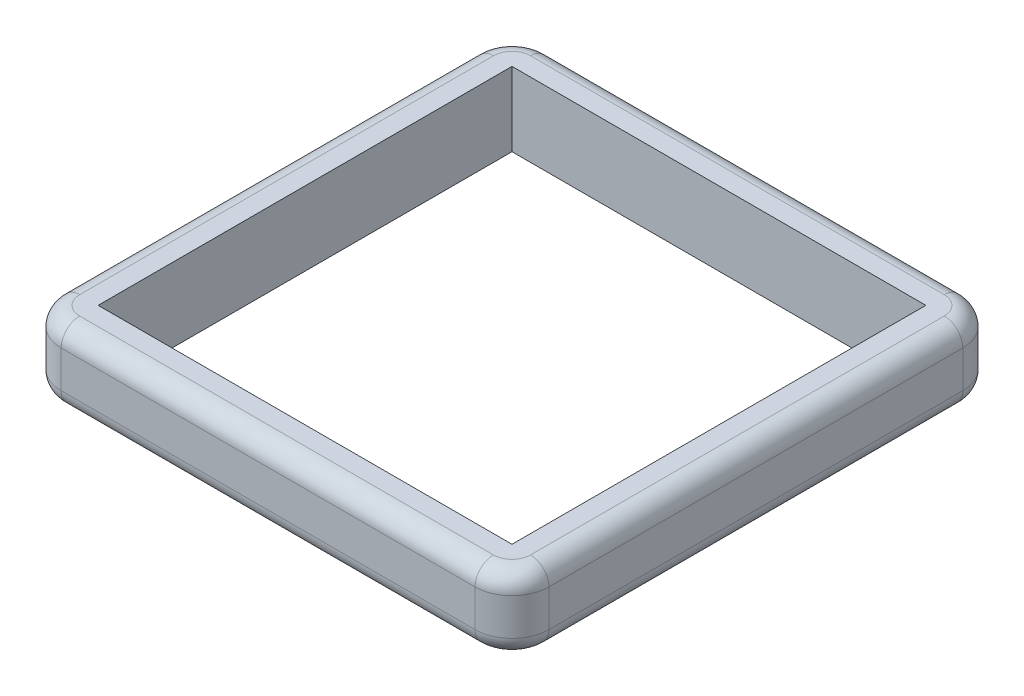
ISO-10303-21;
HEADER;
FILE_DESCRIPTION(('STEP AP214'),'2;1');
FILE_NAME('part.step','',(''),(''),'','','');
FILE_SCHEMA(('AUTOMOTIVE_DESIGN { 1 0 10303 214 1 1 1 1 }'));
ENDSEC;
DATA;
#1=APPLICATION_CONTEXT('core data for automotive mechanical design processes');
#2=APPLICATION_PROTOCOL_DEFINITION('international standard','automotive_design',2000,#1);
#3=PRODUCT_CONTEXT('',#1,'mechanical');
#4=PRODUCT('Part','Part','',(#3));
#5=PRODUCT_RELATED_PRODUCT_CATEGORY('part','',(#4));
#6=PRODUCT_DEFINITION_FORMATION('','',#4);
#7=PRODUCT_DEFINITION_CONTEXT('part definition',#1,'design');
#8=PRODUCT_DEFINITION('design','',#6,#7);
#9=PRODUCT_DEFINITION_SHAPE('','',#8);
#10=(LENGTH_UNIT() NAMED_UNIT(*) SI_UNIT(.MILLI.,.METRE.));
#11=(NAMED_UNIT(*) PLANE_ANGLE_UNIT() SI_UNIT($,.RADIAN.));
#12=(NAMED_UNIT(*) SI_UNIT($,.STERADIAN.) SOLID_ANGLE_UNIT());
#13=UNCERTAINTY_MEASURE_WITH_UNIT(LENGTH_MEASURE(1.E-05),#10,'distance_accuracy_value','');
#14=(GEOMETRIC_REPRESENTATION_CONTEXT(3) GLOBAL_UNCERTAINTY_ASSIGNED_CONTEXT((#13)) GLOBAL_UNIT_ASSIGNED_CONTEXT((#10,
#11,#12)) REPRESENTATION_CONTEXT('',''));
#15=CARTESIAN_POINT('',(0.,0.,0.));
#16=DIRECTION('',(0.,0.,1.));
#17=DIRECTION('',(1.,0.,0.));
#18=AXIS2_PLACEMENT_3D('',#15,#16,#17);
#19=CARTESIAN_POINT('',(711.2,0.,-742.95));
#20=DIRECTION('',(-1.,0.,0.));
#21=DIRECTION('',(0.,0.,1.));
#22=AXIS2_PLACEMENT_3D('',#19,#20,#21);
#23=PLANE('',#22);
#24=DIRECTION('',(0.,1.,0.));
#25=VECTOR('',#24,1.);
#26=CARTESIAN_POINT('',(711.2,0.,-742.95));
#27=LINE('',#26,#25);
#28=CARTESIAN_POINT('',(711.2,-95.25,-742.95));
#29=VERTEX_POINT('',#28);
#30=CARTESIAN_POINT('',(711.2,31.75,-742.95));
#31=VERTEX_POINT('',#30);
#32=EDGE_CURVE('E58',#29,#31,#27,.T.);
#33=ORIENTED_EDGE('',*,*,#32,.F.);
#34=DIRECTION('',(0.,0.,1.));
#35=VECTOR('',#34,1.);
#36=CARTESIAN_POINT('',(711.2,-95.25,-742.95));
#37=LINE('',#36,#35);
#38=CARTESIAN_POINT('',(711.2,-95.25,-31.75));
#39=VERTEX_POINT('',#38);
#40=EDGE_CURVE('E316',#29,#39,#37,.T.);
#41=ORIENTED_EDGE('',*,*,#40,.T.);
#42=DIRECTION('',(0.,-1.,0.));
#43=VECTOR('',#42,1.);
#44=CARTESIAN_POINT('',(711.2,0.,-31.75));
#45=LINE('',#44,#43);
#46=CARTESIAN_POINT('',(711.2,31.75,-31.75));
#47=VERTEX_POINT('',#46);
#48=EDGE_CURVE('E298',#47,#39,#45,.T.);
#49=ORIENTED_EDGE('',*,*,#48,.F.);
#50=DIRECTION('',(0.,0.,1.));
#51=VECTOR('',#50,1.);
#52=CARTESIAN_POINT('',(711.2,31.75,-742.95));
#53=LINE('',#52,#51);
#54=EDGE_CURVE('E314',#31,#47,#53,.T.);
#55=ORIENTED_EDGE('',*,*,#54,.F.);
#56=EDGE_LOOP('',(#33,#41,#49,#55));
#57=FACE_BOUND('',#56,.T.);
#58=ADVANCED_FACE('F43',(#57),#23,.T.);
#59=CARTESIAN_POINT('',(711.2,0.,-31.75));
#60=DIRECTION('',(0.,0.,-1.));
#61=DIRECTION('',(-1.,0.,0.));
#62=AXIS2_PLACEMENT_3D('',#59,#60,#61);
#63=PLANE('',#62);
#64=DIRECTION('',(0.,1.,0.));
#65=VECTOR('',#64,1.);
#66=CARTESIAN_POINT('',(0.,0.,-31.75));
#67=LINE('',#66,#65);
#68=CARTESIAN_POINT('',(0.,-95.25,-31.75));
#69=VERTEX_POINT('',#68);
#70=CARTESIAN_POINT('',(0.,31.75,-31.75));
#71=VERTEX_POINT('',#70);
#72=EDGE_CURVE('E255',#69,#71,#67,.T.);
#73=ORIENTED_EDGE('',*,*,#72,.T.);
#74=DIRECTION('',(-1.,0.,0.));
#75=VECTOR('',#74,1.);
#76=CARTESIAN_POINT('',(711.2,31.75,-31.75));
#77=LINE('',#76,#75);
#78=EDGE_CURVE('E366',#47,#71,#77,.T.);
#79=ORIENTED_EDGE('',*,*,#78,.F.);
#80=ORIENTED_EDGE('',*,*,#48,.T.);
#81=DIRECTION('',(-1.,0.,0.));
#82=VECTOR('',#81,1.);
#83=CARTESIAN_POINT('',(711.2,-95.25,-31.75));
#84=LINE('',#83,#82);
#85=EDGE_CURVE('E66',#39,#69,#84,.T.);
#86=ORIENTED_EDGE('',*,*,#85,.T.);
#87=EDGE_LOOP('',(#73,#79,#80,#86));
#88=FACE_BOUND('',#87,.T.);
#89=ADVANCED_FACE('F439',(#88),#63,.T.);
#90=CARTESIAN_POINT('',(711.2,0.,31.75));
#91=DIRECTION('',(0.,0.,-1.));
#92=DIRECTION('',(-1.,0.,0.));
#93=AXIS2_PLACEMENT_3D('',#90,#91,#92);
#94=PLANE('',#93);
#95=DIRECTION('',(0.,-1.,0.));
#96=VECTOR('',#95,1.);
#97=CARTESIAN_POINT('',(0.,0.,31.75));
#98=LINE('',#97,#96);
#99=CARTESIAN_POINT('',(0.,0.,31.75));
#100=VERTEX_POINT('',#99);
#101=CARTESIAN_POINT('',(0.,-63.5,31.75));
#102=VERTEX_POINT('',#101);
#103=EDGE_CURVE('E342',#100,#102,#98,.T.);
#104=ORIENTED_EDGE('',*,*,#103,.T.);
#105=DIRECTION('',(-1.,0.,0.));
#106=VECTOR('',#105,1.);
#107=CARTESIAN_POINT('',(711.2,-63.5,31.75));
#108=LINE('',#107,#106);
#109=CARTESIAN_POINT('',(711.2,-63.5,31.75));
#110=VERTEX_POINT('',#109);
#111=EDGE_CURVE('E11',#110,#102,#108,.T.);
#112=ORIENTED_EDGE('',*,*,#111,.F.);
#113=DIRECTION('',(0.,-1.,0.));
#114=VECTOR('',#113,1.);
#115=CARTESIAN_POINT('',(711.2,0.,31.75));
#116=LINE('',#115,#114);
#117=CARTESIAN_POINT('',(711.2,0.,31.75));
#118=VERTEX_POINT('',#117);
#119=EDGE_CURVE('E343',#118,#110,#116,.T.);
#120=ORIENTED_EDGE('',*,*,#119,.F.);
#121=DIRECTION('',(-1.,0.,0.));
#122=VECTOR('',#121,1.);
#123=CARTESIAN_POINT('',(711.2,0.,31.75));
#124=LINE('',#123,#122);
#125=EDGE_CURVE('E353',#118,#100,#124,.T.);
#126=ORIENTED_EDGE('',*,*,#125,.T.);
#127=EDGE_LOOP('',(#104,#112,#120,#126));
#128=FACE_BOUND('',#127,.T.);
#129=ADVANCED_FACE('F45',(#128),#94,.F.);
#130=CARTESIAN_POINT('',(711.2,-63.5,0.));
#131=DIRECTION('',(-1.,0.,0.));
#132=DIRECTION('',(0.,0.,1.));
#133=AXIS2_PLACEMENT_3D('',#130,#131,#132);
#134=CYLINDRICAL_SURFACE('',#133,31.75);
#135=CARTESIAN_POINT('',(0.,-63.5,0.));
#136=DIRECTION('',(1.,0.,0.));
#137=DIRECTION('',(0.,0.,-1.));
#138=AXIS2_PLACEMENT_3D('',#135,#136,#137);
#139=CIRCLE('',#138,31.75);
#140=CARTESIAN_POINT('',(0.,-95.25,0.));
#141=VERTEX_POINT('',#140);
#142=EDGE_CURVE('E356',#102,#141,#139,.T.);
#143=ORIENTED_EDGE('',*,*,#142,.T.);
#144=DIRECTION('',(-1.,0.,0.));
#145=VECTOR('',#144,1.);
#146=CARTESIAN_POINT('',(711.2,-95.25,0.));
#147=LINE('',#146,#145);
#148=CARTESIAN_POINT('',(711.2,-95.25,0.));
#149=VERTEX_POINT('',#148);
#150=EDGE_CURVE('E51',#149,#141,#147,.T.);
#151=ORIENTED_EDGE('',*,*,#150,.F.);
#152=CARTESIAN_POINT('',(711.2,-63.5,0.));
#153=DIRECTION('',(1.,0.,0.));
#154=DIRECTION('',(0.,0.,-1.));
#155=AXIS2_PLACEMENT_3D('',#152,#153,#154);
#156=CIRCLE('',#155,31.75);
#157=EDGE_CURVE('E346',#110,#149,#156,.T.);
#158=ORIENTED_EDGE('',*,*,#157,.F.);
#159=ORIENTED_EDGE('',*,*,#111,.T.);
#160=EDGE_LOOP('',(#143,#151,#158,#159));
#161=FACE_BOUND('',#160,.T.);
#162=ADVANCED_FACE('F371',(#161),#134,.T.);
#163=CARTESIAN_POINT('',(711.2,-95.25,0.));
#164=DIRECTION('',(0.,1.,0.));
#165=DIRECTION('',(0.,0.,1.));
#166=AXIS2_PLACEMENT_3D('',#163,#164,#165);
#167=PLANE('',#166);
#168=DIRECTION('',(-1.,0.,0.));
#169=VECTOR('',#168,1.);
#170=CARTESIAN_POINT('',(711.2,-95.25,-774.7));
#171=LINE('',#170,#169);
#172=CARTESIAN_POINT('',(711.2,-95.25,-774.7));
#173=VERTEX_POINT('',#172);
#174=CARTESIAN_POINT('',(1.11022302462516E-13,-95.25,-774.7));
#175=VERTEX_POINT('',#174);
#176=EDGE_CURVE('E242',#173,#175,#171,.T.);
#177=ORIENTED_EDGE('',*,*,#176,.F.);
#178=CARTESIAN_POINT('',(711.2,-95.25,-742.95));
#179=DIRECTION('',(0.,-1.,0.));
#180=DIRECTION('',(0.,0.,-1.));
#181=AXIS2_PLACEMENT_3D('',#178,#179,#180);
#182=CIRCLE('',#181,31.7500000000002);
#183=CARTESIAN_POINT('',(742.95,-95.25,-742.95));
#184=VERTEX_POINT('',#183);
#185=EDGE_CURVE('E289',#173,#184,#182,.T.);
#186=ORIENTED_EDGE('',*,*,#185,.T.);
#187=DIRECTION('',(0.,0.,1.));
#188=VECTOR('',#187,1.);
#189=CARTESIAN_POINT('',(742.95,-95.25,-742.95));
#190=LINE('',#189,#188);
#191=CARTESIAN_POINT('',(742.95,-95.25,-31.75));
#192=VERTEX_POINT('',#191);
#193=EDGE_CURVE('E318',#184,#192,#190,.T.);
#194=ORIENTED_EDGE('',*,*,#193,.T.);
#195=CARTESIAN_POINT('',(711.2,-95.25,-31.75));
#196=DIRECTION('',(0.,-1.,0.));
#197=DIRECTION('',(0.,0.,-1.));
#198=AXIS2_PLACEMENT_3D('',#195,#196,#197);
#199=CIRCLE('',#198,31.7500000000001);
#200=EDGE_CURVE('E333',#192,#149,#199,.T.);
#201=ORIENTED_EDGE('',*,*,#200,.T.);
#202=ORIENTED_EDGE('',*,*,#150,.T.);
#203=CARTESIAN_POINT('',(0.,-95.25,-31.75));
#204=DIRECTION('',(0.,1.,0.));
#205=DIRECTION('',(0.,0.,1.));
#206=AXIS2_PLACEMENT_3D('',#203,#204,#205);
#207=CIRCLE('',#206,31.75);
#208=CARTESIAN_POINT('',(-31.75,-95.25,-31.7500000000001));
#209=VERTEX_POINT('',#208);
#210=EDGE_CURVE('E200',#209,#141,#207,.T.);
#211=ORIENTED_EDGE('',*,*,#210,.F.);
#212=DIRECTION('',(0.,0.,1.));
#213=VECTOR('',#212,1.);
#214=CARTESIAN_POINT('',(-31.75,-95.25,-742.95));
#215=LINE('',#214,#213);
#216=CARTESIAN_POINT('',(-31.75,-95.25,-742.95));
#217=VERTEX_POINT('',#216);
#218=EDGE_CURVE('E196',#217,#209,#215,.T.);
#219=ORIENTED_EDGE('',*,*,#218,.F.);
#220=CARTESIAN_POINT('',(0.,-95.25,-742.95));
#221=DIRECTION('',(0.,1.,0.));
#222=DIRECTION('',(0.,0.,1.));
#223=AXIS2_PLACEMENT_3D('',#220,#221,#222);
#224=CIRCLE('',#223,31.7500000000001);
#225=EDGE_CURVE('E181',#175,#217,#224,.T.);
#226=ORIENTED_EDGE('',*,*,#225,.F.);
#227=EDGE_LOOP('',(#177,#186,#194,#201,#202,#211,#219,#226));
#228=FACE_BOUND('',#227,.T.);
#229=ORIENTED_EDGE('',*,*,#40,.F.);
#230=DIRECTION('',(-1.,0.,0.));
#231=VECTOR('',#230,1.);
#232=CARTESIAN_POINT('',(711.2,-95.25,-742.95));
#233=LINE('',#232,#231);
#234=CARTESIAN_POINT('',(0.,-95.25,-742.95));
#235=VERTEX_POINT('',#234);
#236=EDGE_CURVE('E244',#29,#235,#233,.T.);
#237=ORIENTED_EDGE('',*,*,#236,.T.);
#238=DIRECTION('',(0.,0.,1.));
#239=VECTOR('',#238,1.);
#240=CARTESIAN_POINT('',(0.,-95.25,-742.95));
#241=LINE('',#240,#239);
#242=EDGE_CURVE('E204',#235,#69,#241,.T.);
#243=ORIENTED_EDGE('',*,*,#242,.T.);
#244=ORIENTED_EDGE('',*,*,#85,.F.);
#245=EDGE_LOOP('',(#229,#237,#243,#244));
#246=FACE_BOUND('',#245,.T.);
#247=ADVANCED_FACE('F197',(#228,#246),#167,.F.);
#248=CARTESIAN_POINT('',(711.2,31.75,0.));
#249=DIRECTION('',(0.,1.,0.));
#250=DIRECTION('',(0.,0.,1.));
#251=AXIS2_PLACEMENT_3D('',#248,#249,#250);
#252=PLANE('',#251);
#253=DIRECTION('',(-1.,0.,0.));
#254=VECTOR('',#253,1.);
#255=CARTESIAN_POINT('',(711.2,31.75,-742.95));
#256=LINE('',#255,#254);
#257=CARTESIAN_POINT('',(0.,31.75,-742.95));
#258=VERTEX_POINT('',#257);
#259=EDGE_CURVE('E247',#31,#258,#256,.T.);
#260=ORIENTED_EDGE('',*,*,#259,.F.);
#261=ORIENTED_EDGE('',*,*,#54,.T.);
#262=ORIENTED_EDGE('',*,*,#78,.T.);
#263=DIRECTION('',(0.,0.,1.));
#264=VECTOR('',#263,1.);
#265=CARTESIAN_POINT('',(0.,31.75,-742.95));
#266=LINE('',#265,#264);
#267=EDGE_CURVE('E259',#258,#71,#266,.T.);
#268=ORIENTED_EDGE('',*,*,#267,.F.);
#269=EDGE_LOOP('',(#260,#261,#262,#268));
#270=FACE_BOUND('',#269,.T.);
#271=CARTESIAN_POINT('',(711.2,31.7499999999999,-742.95));
#272=DIRECTION('',(0.,-1.,0.));
#273=DIRECTION('',(0.,0.,-1.));
#274=AXIS2_PLACEMENT_3D('',#271,#272,#273);
#275=CIRCLE('',#274,31.7500000000002);
#276=CARTESIAN_POINT('',(711.2,31.75,-774.7));
#277=VERTEX_POINT('',#276);
#278=CARTESIAN_POINT('',(742.95,31.75,-742.95));
#279=VERTEX_POINT('',#278);
#280=EDGE_CURVE('E286',#277,#279,#275,.T.);
#281=ORIENTED_EDGE('',*,*,#280,.F.);
#282=DIRECTION('',(-1.,0.,0.));
#283=VECTOR('',#282,1.);
#284=CARTESIAN_POINT('',(711.2,31.75,-774.7));
#285=LINE('',#284,#283);
#286=CARTESIAN_POINT('',(0.,31.75,-774.7));
#287=VERTEX_POINT('',#286);
#288=EDGE_CURVE('E249',#277,#287,#285,.T.);
#289=ORIENTED_EDGE('',*,*,#288,.T.);
#290=CARTESIAN_POINT('',(0.,31.75,-742.95));
#291=DIRECTION('',(0.,1.,0.));
#292=DIRECTION('',(0.,0.,1.));
#293=AXIS2_PLACEMENT_3D('',#290,#291,#292);
#294=CIRCLE('',#293,31.7500000000001);
#295=CARTESIAN_POINT('',(-31.75,31.75,-742.95));
#296=VERTEX_POINT('',#295);
#297=EDGE_CURVE('E218',#287,#296,#294,.T.);
#298=ORIENTED_EDGE('',*,*,#297,.T.);
#299=DIRECTION('',(0.,0.,1.));
#300=VECTOR('',#299,1.);
#301=CARTESIAN_POINT('',(-31.75,31.75,-742.95));
#302=LINE('',#301,#300);
#303=CARTESIAN_POINT('',(-31.75,31.75,-31.75));
#304=VERTEX_POINT('',#303);
#305=EDGE_CURVE('E263',#296,#304,#302,.T.);
#306=ORIENTED_EDGE('',*,*,#305,.T.);
#307=CARTESIAN_POINT('',(0.,31.75,-31.75));
#308=DIRECTION('',(0.,1.,0.));
#309=DIRECTION('',(0.,0.,1.));
#310=AXIS2_PLACEMENT_3D('',#307,#308,#309);
#311=CIRCLE('',#310,31.75);
#312=CARTESIAN_POINT('',(0.,31.75,0.));
#313=VERTEX_POINT('',#312);
#314=EDGE_CURVE('E280',#304,#313,#311,.T.);
#315=ORIENTED_EDGE('',*,*,#314,.T.);
#316=DIRECTION('',(-1.,0.,0.));
#317=VECTOR('',#316,1.);
#318=CARTESIAN_POINT('',(711.2,31.75,0.));
#319=LINE('',#318,#317);
#320=CARTESIAN_POINT('',(711.2,31.75,0.));
#321=VERTEX_POINT('',#320);
#322=EDGE_CURVE('E363',#321,#313,#319,.T.);
#323=ORIENTED_EDGE('',*,*,#322,.F.);
#324=CARTESIAN_POINT('',(711.2,31.75,-31.75));
#325=DIRECTION('',(0.,-1.,0.));
#326=DIRECTION('',(0.,0.,-1.));
#327=AXIS2_PLACEMENT_3D('',#324,#325,#326);
#328=CIRCLE('',#327,31.7500000000001);
#329=CARTESIAN_POINT('',(742.95,31.75,-31.75));
#330=VERTEX_POINT('',#329);
#331=EDGE_CURVE('E330',#330,#321,#328,.T.);
#332=ORIENTED_EDGE('',*,*,#331,.F.);
#333=DIRECTION('',(0.,0.,1.));
#334=VECTOR('',#333,1.);
#335=CARTESIAN_POINT('',(742.95,31.75,-742.95));
#336=LINE('',#335,#334);
#337=EDGE_CURVE('E312',#279,#330,#336,.T.);
#338=ORIENTED_EDGE('',*,*,#337,.F.);
#339=EDGE_LOOP('',(#281,#289,#298,#306,#315,#323,#332,#338));
#340=FACE_BOUND('',#339,.T.);
#341=ADVANCED_FACE('F460',(#270,#340),#252,.T.);
#342=CARTESIAN_POINT('',(711.2,0.,0.));
#343=DIRECTION('',(-1.,0.,0.));
#344=DIRECTION('',(0.,0.,1.));
#345=AXIS2_PLACEMENT_3D('',#342,#343,#344);
#346=CYLINDRICAL_SURFACE('',#345,31.75);
#347=CARTESIAN_POINT('',(0.,0.,0.));
#348=DIRECTION('',(1.,0.,0.));
#349=DIRECTION('',(0.,0.,-1.));
#350=AXIS2_PLACEMENT_3D('',#347,#348,#349);
#351=CIRCLE('',#350,31.75);
#352=EDGE_CURVE('E347',#313,#100,#351,.T.);
#353=ORIENTED_EDGE('',*,*,#352,.T.);
#354=ORIENTED_EDGE('',*,*,#125,.F.);
#355=CARTESIAN_POINT('',(711.2,0.,0.));
#356=DIRECTION('',(1.,0.,0.));
#357=DIRECTION('',(0.,0.,-1.));
#358=AXIS2_PLACEMENT_3D('',#355,#356,#357);
#359=CIRCLE('',#358,31.75);
#360=EDGE_CURVE('E350',#321,#118,#359,.T.);
#361=ORIENTED_EDGE('',*,*,#360,.F.);
#362=ORIENTED_EDGE('',*,*,#322,.T.);
#363=EDGE_LOOP('',(#353,#354,#361,#362));
#364=FACE_BOUND('',#363,.T.);
#365=ADVANCED_FACE('F453',(#364),#346,.T.);
#366=CARTESIAN_POINT('',(711.2,0.,-31.75));
#367=DIRECTION('',(0.,-1.,0.));
#368=DIRECTION('',(0.,0.,-1.));
#369=AXIS2_PLACEMENT_3D('',#366,#367,#368);
#370=TOROIDAL_SURFACE('',#369,31.7500000000001,31.75);
#371=CARTESIAN_POINT('',(711.2,0.,-31.75));
#372=DIRECTION('',(0.,-1.,0.));
#373=DIRECTION('',(0.,0.,-1.));
#374=AXIS2_PLACEMENT_3D('',#371,#372,#373);
#375=CIRCLE('',#374,63.5);
#376=CARTESIAN_POINT('',(774.7,0.,-31.75));
#377=VERTEX_POINT('',#376);
#378=EDGE_CURVE('E339',#377,#118,#375,.T.);
#379=ORIENTED_EDGE('',*,*,#378,.F.);
#380=CARTESIAN_POINT('',(742.95,0.,-31.7500000000001));
#381=DIRECTION('',(0.,0.,-1.));
#382=DIRECTION('',(-1.,0.,0.));
#383=AXIS2_PLACEMENT_3D('',#380,#381,#382);
#384=CIRCLE('',#383,31.75);
#385=EDGE_CURVE('E323',#330,#377,#384,.T.);
#386=ORIENTED_EDGE('',*,*,#385,.F.);
#387=ORIENTED_EDGE('',*,*,#331,.T.);
#388=ORIENTED_EDGE('',*,*,#360,.T.);
#389=EDGE_LOOP('',(#379,#386,#387,#388));
#390=FACE_BOUND('',#389,.T.);
#391=ADVANCED_FACE('F418',(#390),#370,.T.);
#392=CARTESIAN_POINT('',(711.2,-95.25,-31.75));
#393=DIRECTION('',(0.,-1.,0.));
#394=DIRECTION('',(0.,0.,-1.));
#395=AXIS2_PLACEMENT_3D('',#392,#393,#394);
#396=CYLINDRICAL_SURFACE('',#395,63.5);
#397=CARTESIAN_POINT('',(711.2,-63.5,-31.75));
#398=DIRECTION('',(0.,-1.,0.));
#399=DIRECTION('',(0.,0.,-1.));
#400=AXIS2_PLACEMENT_3D('',#397,#398,#399);
#401=CIRCLE('',#400,63.5);
#402=CARTESIAN_POINT('',(774.7,-63.5,-31.75));
#403=VERTEX_POINT('',#402);
#404=EDGE_CURVE('E336',#403,#110,#401,.T.);
#405=ORIENTED_EDGE('',*,*,#404,.F.);
#406=DIRECTION('',(0.,-1.,0.));
#407=VECTOR('',#406,1.);
#408=CARTESIAN_POINT('',(774.7,0.,-31.7500000000002));
#409=LINE('',#408,#407);
#410=EDGE_CURVE('E325',#377,#403,#409,.T.);
#411=ORIENTED_EDGE('',*,*,#410,.F.);
#412=ORIENTED_EDGE('',*,*,#378,.T.);
#413=ORIENTED_EDGE('',*,*,#119,.T.);
#414=EDGE_LOOP('',(#405,#411,#412,#413));
#415=FACE_BOUND('',#414,.T.);
#416=ADVANCED_FACE('F421',(#415),#396,.T.);
#417=CARTESIAN_POINT('',(711.2,-63.5,-31.75));
#418=DIRECTION('',(0.,-1.,0.));
#419=DIRECTION('',(0.,0.,-1.));
#420=AXIS2_PLACEMENT_3D('',#417,#418,#419);
#421=TOROIDAL_SURFACE('',#420,31.7500000000001,31.75);
#422=ORIENTED_EDGE('',*,*,#200,.F.);
#423=CARTESIAN_POINT('',(742.95,-63.5,-31.7500000000001));
#424=DIRECTION('',(0.,0.,-1.));
#425=DIRECTION('',(-1.,0.,0.));
#426=AXIS2_PLACEMENT_3D('',#423,#424,#425);
#427=CIRCLE('',#426,31.75);
#428=EDGE_CURVE('E328',#403,#192,#427,.T.);
#429=ORIENTED_EDGE('',*,*,#428,.F.);
#430=ORIENTED_EDGE('',*,*,#404,.T.);
#431=ORIENTED_EDGE('',*,*,#157,.T.);
#432=EDGE_LOOP('',(#422,#429,#430,#431));
#433=FACE_BOUND('',#432,.T.);
#434=ADVANCED_FACE('F424',(#433),#421,.T.);
#435=CARTESIAN_POINT('',(774.7,0.,-742.95));
#436=DIRECTION('',(-1.,0.,0.));
#437=DIRECTION('',(0.,0.,1.));
#438=AXIS2_PLACEMENT_3D('',#435,#436,#437);
#439=PLANE('',#438);
#440=ORIENTED_EDGE('',*,*,#410,.T.);
#441=DIRECTION('',(0.,0.,1.));
#442=VECTOR('',#441,1.);
#443=CARTESIAN_POINT('',(774.7,-63.5,-742.95));
#444=LINE('',#443,#442);
#445=CARTESIAN_POINT('',(774.7,-63.5,-742.95));
#446=VERTEX_POINT('',#445);
#447=EDGE_CURVE('E321',#446,#403,#444,.T.);
#448=ORIENTED_EDGE('',*,*,#447,.F.);
#449=DIRECTION('',(0.,-1.,0.));
#450=VECTOR('',#449,1.);
#451=CARTESIAN_POINT('',(774.7,0.,-742.95));
#452=LINE('',#451,#450);
#453=CARTESIAN_POINT('',(774.7,0.,-742.95));
#454=VERTEX_POINT('',#453);
#455=EDGE_CURVE('E299',#454,#446,#452,.T.);
#456=ORIENTED_EDGE('',*,*,#455,.F.);
#457=DIRECTION('',(0.,0.,1.));
#458=VECTOR('',#457,1.);
#459=CARTESIAN_POINT('',(774.7,0.,-742.95));
#460=LINE('',#459,#458);
#461=EDGE_CURVE('E308',#454,#377,#460,.T.);
#462=ORIENTED_EDGE('',*,*,#461,.T.);
#463=EDGE_LOOP('',(#440,#448,#456,#462));
#464=FACE_BOUND('',#463,.T.);
#465=ADVANCED_FACE('F413',(#464),#439,.F.);
#466=CARTESIAN_POINT('',(742.95,-63.5,-742.95));
#467=DIRECTION('',(0.,0.,1.));
#468=DIRECTION('',(1.,0.,0.));
#469=AXIS2_PLACEMENT_3D('',#466,#467,#468);
#470=CYLINDRICAL_SURFACE('',#469,31.75);
#471=ORIENTED_EDGE('',*,*,#428,.T.);
#472=ORIENTED_EDGE('',*,*,#193,.F.);
#473=CARTESIAN_POINT('',(742.95,-63.5,-742.95));
#474=DIRECTION('',(0.,0.,-1.));
#475=DIRECTION('',(-1.,0.,0.));
#476=AXIS2_PLACEMENT_3D('',#473,#474,#475);
#477=CIRCLE('',#476,31.75);
#478=EDGE_CURVE('E302',#446,#184,#477,.T.);
#479=ORIENTED_EDGE('',*,*,#478,.F.);
#480=ORIENTED_EDGE('',*,*,#447,.T.);
#481=EDGE_LOOP('',(#471,#472,#479,#480));
#482=FACE_BOUND('',#481,.T.);
#483=ADVANCED_FACE('F426',(#482),#470,.T.);
#484=CARTESIAN_POINT('',(742.95,0.,-742.95));
#485=DIRECTION('',(0.,0.,1.));
#486=DIRECTION('',(1.,0.,0.));
#487=AXIS2_PLACEMENT_3D('',#484,#485,#486);
#488=CYLINDRICAL_SURFACE('',#487,31.75);
#489=ORIENTED_EDGE('',*,*,#385,.T.);
#490=ORIENTED_EDGE('',*,*,#461,.F.);
#491=CARTESIAN_POINT('',(742.95,0.,-742.95));
#492=DIRECTION('',(0.,0.,-1.));
#493=DIRECTION('',(-1.,0.,0.));
#494=AXIS2_PLACEMENT_3D('',#491,#492,#493);
#495=CIRCLE('',#494,31.75);
#496=EDGE_CURVE('E305',#279,#454,#495,.T.);
#497=ORIENTED_EDGE('',*,*,#496,.F.);
#498=ORIENTED_EDGE('',*,*,#337,.T.);
#499=EDGE_LOOP('',(#489,#490,#497,#498));
#500=FACE_BOUND('',#499,.T.);
#501=ADVANCED_FACE('F408',(#500),#488,.T.);
#502=CARTESIAN_POINT('',(711.2,0.,-742.95));
#503=DIRECTION('',(0.,-1.,0.));
#504=DIRECTION('',(0.,0.,-1.));
#505=AXIS2_PLACEMENT_3D('',#502,#503,#504);
#506=TOROIDAL_SURFACE('',#505,31.7500000000002,31.75);
#507=CARTESIAN_POINT('',(711.2,0.,-742.95));
#508=DIRECTION('',(0.,-1.,0.));
#509=DIRECTION('',(0.,0.,-1.));
#510=AXIS2_PLACEMENT_3D('',#507,#508,#509);
#511=CIRCLE('',#510,63.5000000000001);
#512=CARTESIAN_POINT('',(711.2,0.,-806.45));
#513=VERTEX_POINT('',#512);
#514=EDGE_CURVE('E295',#513,#454,#511,.T.);
#515=ORIENTED_EDGE('',*,*,#514,.F.);
#516=CARTESIAN_POINT('',(711.2,0.,-774.7));
#517=DIRECTION('',(1.,0.,0.));
#518=DIRECTION('',(0.,0.,-1.));
#519=AXIS2_PLACEMENT_3D('',#516,#517,#518);
#520=CIRCLE('',#519,31.75);
#521=EDGE_CURVE('E226',#513,#277,#520,.T.);
#522=ORIENTED_EDGE('',*,*,#521,.T.);
#523=ORIENTED_EDGE('',*,*,#280,.T.);
#524=ORIENTED_EDGE('',*,*,#496,.T.);
#525=EDGE_LOOP('',(#515,#522,#523,#524));
#526=FACE_BOUND('',#525,.T.);
#527=ADVANCED_FACE('F404',(#526),#506,.T.);
#528=CARTESIAN_POINT('',(711.2,-95.25,-742.95));
#529=DIRECTION('',(0.,-1.,0.));
#530=DIRECTION('',(0.,0.,-1.));
#531=AXIS2_PLACEMENT_3D('',#528,#529,#530);
#532=CYLINDRICAL_SURFACE('',#531,63.5000000000001);
#533=CARTESIAN_POINT('',(711.2,-63.5,-742.95));
#534=DIRECTION('',(0.,-1.,0.));
#535=DIRECTION('',(0.,0.,-1.));
#536=AXIS2_PLACEMENT_3D('',#533,#534,#535);
#537=CIRCLE('',#536,63.5000000000001);
#538=CARTESIAN_POINT('',(711.2,-63.5,-806.45));
#539=VERTEX_POINT('',#538);
#540=EDGE_CURVE('E292',#539,#446,#537,.T.);
#541=ORIENTED_EDGE('',*,*,#540,.F.);
#542=DIRECTION('',(0.,1.,0.));
#543=VECTOR('',#542,1.);
#544=CARTESIAN_POINT('',(711.2,0.,-806.45));
#545=LINE('',#544,#543);
#546=EDGE_CURVE('E223',#539,#513,#545,.T.);
#547=ORIENTED_EDGE('',*,*,#546,.T.);
#548=ORIENTED_EDGE('',*,*,#514,.T.);
#549=ORIENTED_EDGE('',*,*,#455,.T.);
#550=EDGE_LOOP('',(#541,#547,#548,#549));
#551=FACE_BOUND('',#550,.T.);
#552=ADVANCED_FACE('F399',(#551),#532,.T.);
#553=CARTESIAN_POINT('',(711.2,-63.5,-742.95));
#554=DIRECTION('',(0.,-1.,0.));
#555=DIRECTION('',(0.,0.,-1.));
#556=AXIS2_PLACEMENT_3D('',#553,#554,#555);
#557=TOROIDAL_SURFACE('',#556,31.7500000000002,31.75);
#558=ORIENTED_EDGE('',*,*,#185,.F.);
#559=CARTESIAN_POINT('',(711.2,-63.5,-774.7));
#560=DIRECTION('',(1.,0.,0.));
#561=DIRECTION('',(0.,0.,-1.));
#562=AXIS2_PLACEMENT_3D('',#559,#560,#561);
#563=CIRCLE('',#562,31.75);
#564=EDGE_CURVE('E230',#173,#539,#563,.T.);
#565=ORIENTED_EDGE('',*,*,#564,.T.);
#566=ORIENTED_EDGE('',*,*,#540,.T.);
#567=ORIENTED_EDGE('',*,*,#478,.T.);
#568=EDGE_LOOP('',(#558,#565,#566,#567));
#569=FACE_BOUND('',#568,.T.);
#570=ADVANCED_FACE('F428',(#569),#557,.T.);
#571=CARTESIAN_POINT('',(0.,-63.5,-31.75));
#572=DIRECTION('',(0.,1.,0.));
#573=DIRECTION('',(0.,0.,1.));
#574=AXIS2_PLACEMENT_3D('',#571,#572,#573);
#575=DEGENERATE_TOROIDAL_SURFACE('',#574,31.75,31.75,.T.);
#576=CARTESIAN_POINT('',(0.,-63.5,-31.75));
#577=DIRECTION('',(0.,1.,0.));
#578=DIRECTION('',(0.,0.,1.));
#579=AXIS2_PLACEMENT_3D('',#576,#577,#578);
#580=CIRCLE('',#579,63.5);
#581=CARTESIAN_POINT('',(-63.5,-63.5,-31.7500000000002));
#582=VERTEX_POINT('',#581);
#583=EDGE_CURVE('E284',#582,#102,#580,.T.);
#584=ORIENTED_EDGE('',*,*,#583,.F.);
#585=CARTESIAN_POINT('',(-31.75,-63.5,-31.7500000000001));
#586=DIRECTION('',(0.,0.,-1.));
#587=DIRECTION('',(-1.,0.,0.));
#588=AXIS2_PLACEMENT_3D('',#585,#586,#587);
#589=CIRCLE('',#588,31.75);
#590=EDGE_CURVE('E271',#209,#582,#589,.T.);
#591=ORIENTED_EDGE('',*,*,#590,.F.);
#592=ORIENTED_EDGE('',*,*,#210,.T.);
#593=ORIENTED_EDGE('',*,*,#142,.F.);
#594=EDGE_LOOP('',(#584,#591,#592,#593));
#595=FACE_BOUND('',#594,.T.);
#596=ADVANCED_FACE('F375',(#595),#575,.T.);
#597=CARTESIAN_POINT('',(0.,31.75,-31.75));
#598=DIRECTION('',(0.,1.,0.));
#599=DIRECTION('',(0.,0.,1.));
#600=AXIS2_PLACEMENT_3D('',#597,#598,#599);
#601=CYLINDRICAL_SURFACE('',#600,63.5);
#602=CARTESIAN_POINT('',(0.,0.,-31.75));
#603=DIRECTION('',(0.,1.,0.));
#604=DIRECTION('',(0.,0.,1.));
#605=AXIS2_PLACEMENT_3D('',#602,#603,#604);
#606=CIRCLE('',#605,63.5);
#607=CARTESIAN_POINT('',(-63.5,0.,-31.7500000000002));
#608=VERTEX_POINT('',#607);
#609=EDGE_CURVE('E282',#608,#100,#606,.T.);
#610=ORIENTED_EDGE('',*,*,#609,.F.);
#611=DIRECTION('',(0.,1.,0.));
#612=VECTOR('',#611,1.);
#613=CARTESIAN_POINT('',(-63.5,0.,-31.7500000000002));
#614=LINE('',#613,#612);
#615=EDGE_CURVE('E273',#582,#608,#614,.T.);
#616=ORIENTED_EDGE('',*,*,#615,.F.);
#617=ORIENTED_EDGE('',*,*,#583,.T.);
#618=ORIENTED_EDGE('',*,*,#103,.F.);
#619=EDGE_LOOP('',(#610,#616,#617,#618));
#620=FACE_BOUND('',#619,.T.);
#621=ADVANCED_FACE('F379',(#620),#601,.T.);
#622=CARTESIAN_POINT('',(0.,0.,-31.75));
#623=DIRECTION('',(0.,1.,0.));
#624=DIRECTION('',(0.,0.,1.));
#625=AXIS2_PLACEMENT_3D('',#622,#623,#624);
#626=DEGENERATE_TOROIDAL_SURFACE('',#625,31.75,31.75,.T.);
#627=ORIENTED_EDGE('',*,*,#314,.F.);
#628=CARTESIAN_POINT('',(-31.75,0.,-31.7500000000001));
#629=DIRECTION('',(0.,0.,-1.));
#630=DIRECTION('',(-1.,0.,0.));
#631=AXIS2_PLACEMENT_3D('',#628,#629,#630);
#632=CIRCLE('',#631,31.75);
#633=EDGE_CURVE('E276',#608,#304,#632,.T.);
#634=ORIENTED_EDGE('',*,*,#633,.F.);
#635=ORIENTED_EDGE('',*,*,#609,.T.);
#636=ORIENTED_EDGE('',*,*,#352,.F.);
#637=EDGE_LOOP('',(#627,#634,#635,#636));
#638=FACE_BOUND('',#637,.T.);
#639=ADVANCED_FACE('F476',(#638),#626,.T.);
#640=CARTESIAN_POINT('',(0.,0.,-742.95));
#641=DIRECTION('',(1.,0.,0.));
#642=DIRECTION('',(0.,0.,-1.));
#643=AXIS2_PLACEMENT_3D('',#640,#641,#642);
#644=PLANE('',#643);
#645=ORIENTED_EDGE('',*,*,#72,.F.);
#646=ORIENTED_EDGE('',*,*,#242,.F.);
#647=DIRECTION('',(0.,1.,0.));
#648=VECTOR('',#647,1.);
#649=CARTESIAN_POINT('',(0.,0.,-742.95));
#650=LINE('',#649,#648);
#651=EDGE_CURVE('E256',#235,#258,#650,.T.);
#652=ORIENTED_EDGE('',*,*,#651,.T.);
#653=ORIENTED_EDGE('',*,*,#267,.T.);
#654=EDGE_LOOP('',(#645,#646,#652,#653));
#655=FACE_BOUND('',#654,.T.);
#656=ADVANCED_FACE('F508',(#655),#644,.T.);
#657=CARTESIAN_POINT('',(-31.75,-63.5,-742.95));
#658=DIRECTION('',(0.,0.,1.));
#659=DIRECTION('',(1.,0.,0.));
#660=AXIS2_PLACEMENT_3D('',#657,#658,#659);
#661=CYLINDRICAL_SURFACE('',#660,31.75);
#662=ORIENTED_EDGE('',*,*,#590,.T.);
#663=DIRECTION('',(0.,0.,1.));
#664=VECTOR('',#663,1.);
#665=CARTESIAN_POINT('',(-63.5,-63.5,-742.95));
#666=LINE('',#665,#664);
#667=CARTESIAN_POINT('',(-63.5,-63.5,-742.95));
#668=VERTEX_POINT('',#667);
#669=EDGE_CURVE('E205',#668,#582,#666,.T.);
#670=ORIENTED_EDGE('',*,*,#669,.F.);
#671=CARTESIAN_POINT('',(-31.75,-63.5,-742.95));
#672=DIRECTION('',(0.,0.,-1.));
#673=DIRECTION('',(-1.,0.,0.));
#674=AXIS2_PLACEMENT_3D('',#671,#672,#673);
#675=CIRCLE('',#674,31.75);
#676=EDGE_CURVE('E185',#217,#668,#675,.T.);
#677=ORIENTED_EDGE('',*,*,#676,.F.);
#678=ORIENTED_EDGE('',*,*,#218,.T.);
#679=EDGE_LOOP('',(#662,#670,#677,#678));
#680=FACE_BOUND('',#679,.T.);
#681=ADVANCED_FACE('F207',(#680),#661,.T.);
#682=CARTESIAN_POINT('',(-63.5,0.,-742.95));
#683=DIRECTION('',(-1.,0.,0.));
#684=DIRECTION('',(0.,0.,1.));
#685=AXIS2_PLACEMENT_3D('',#682,#683,#684);
#686=PLANE('',#685);
#687=ORIENTED_EDGE('',*,*,#615,.T.);
#688=DIRECTION('',(0.,0.,1.));
#689=VECTOR('',#688,1.);
#690=CARTESIAN_POINT('',(-63.5,0.,-742.95));
#691=LINE('',#690,#689);
#692=CARTESIAN_POINT('',(-63.5,0.,-742.95));
#693=VERTEX_POINT('',#692);
#694=EDGE_CURVE('E266',#693,#608,#691,.T.);
#695=ORIENTED_EDGE('',*,*,#694,.F.);
#696=DIRECTION('',(0.,1.,0.));
#697=VECTOR('',#696,1.);
#698=CARTESIAN_POINT('',(-63.5,0.,-742.95));
#699=LINE('',#698,#697);
#700=EDGE_CURVE('E210',#668,#693,#699,.T.);
#701=ORIENTED_EDGE('',*,*,#700,.F.);
#702=ORIENTED_EDGE('',*,*,#669,.T.);
#703=EDGE_LOOP('',(#687,#695,#701,#702));
#704=FACE_BOUND('',#703,.T.);
#705=ADVANCED_FACE('F383',(#704),#686,.T.);
#706=CARTESIAN_POINT('',(-31.75,0.,-742.95));
#707=DIRECTION('',(0.,0.,1.));
#708=DIRECTION('',(1.,0.,0.));
#709=AXIS2_PLACEMENT_3D('',#706,#707,#708);
#710=CYLINDRICAL_SURFACE('',#709,31.75);
#711=ORIENTED_EDGE('',*,*,#633,.T.);
#712=ORIENTED_EDGE('',*,*,#305,.F.);
#713=CARTESIAN_POINT('',(-31.75,0.,-742.95));
#714=DIRECTION('',(0.,0.,-1.));
#715=DIRECTION('',(-1.,0.,0.));
#716=AXIS2_PLACEMENT_3D('',#713,#714,#715);
#717=CIRCLE('',#716,31.75);
#718=EDGE_CURVE('E213',#693,#296,#717,.T.);
#719=ORIENTED_EDGE('',*,*,#718,.F.);
#720=ORIENTED_EDGE('',*,*,#694,.T.);
#721=EDGE_LOOP('',(#711,#712,#719,#720));
#722=FACE_BOUND('',#721,.T.);
#723=ADVANCED_FACE('F479',(#722),#710,.T.);
#724=CARTESIAN_POINT('',(711.2,0.,-806.45));
#725=DIRECTION('',(0.,0.,1.));
#726=DIRECTION('',(1.,0.,0.));
#727=AXIS2_PLACEMENT_3D('',#724,#725,#726);
#728=PLANE('',#727);
#729=DIRECTION('',(0.,1.,0.));
#730=VECTOR('',#729,1.);
#731=CARTESIAN_POINT('',(0.,0.,-806.45));
#732=LINE('',#731,#730);
#733=CARTESIAN_POINT('',(2.22044604925031E-13,-63.5,-806.45));
#734=VERTEX_POINT('',#733);
#735=CARTESIAN_POINT('',(2.22044604925031E-13,0.,-806.45));
#736=VERTEX_POINT('',#735);
#737=EDGE_CURVE('E192',#734,#736,#732,.T.);
#738=ORIENTED_EDGE('',*,*,#737,.T.);
#739=DIRECTION('',(-1.,0.,0.));
#740=VECTOR('',#739,1.);
#741=CARTESIAN_POINT('',(711.2,0.,-806.45));
#742=LINE('',#741,#740);
#743=EDGE_CURVE('E252',#513,#736,#742,.T.);
#744=ORIENTED_EDGE('',*,*,#743,.F.);
#745=ORIENTED_EDGE('',*,*,#546,.F.);
#746=DIRECTION('',(-1.,0.,0.));
#747=VECTOR('',#746,1.);
#748=CARTESIAN_POINT('',(711.2,-63.5,-806.45));
#749=LINE('',#748,#747);
#750=EDGE_CURVE('E233',#539,#734,#749,.T.);
#751=ORIENTED_EDGE('',*,*,#750,.T.);
#752=EDGE_LOOP('',(#738,#744,#745,#751));
#753=FACE_BOUND('',#752,.T.);
#754=ADVANCED_FACE('F396',(#753),#728,.F.);
#755=CARTESIAN_POINT('',(711.2,0.,-774.7));
#756=DIRECTION('',(-1.,0.,0.));
#757=DIRECTION('',(0.,0.,1.));
#758=AXIS2_PLACEMENT_3D('',#755,#756,#757);
#759=CYLINDRICAL_SURFACE('',#758,31.75);
#760=CARTESIAN_POINT('',(0.,0.,-774.7));
#761=DIRECTION('',(1.,0.,0.));
#762=DIRECTION('',(0.,0.,-1.));
#763=AXIS2_PLACEMENT_3D('',#760,#761,#762);
#764=CIRCLE('',#763,31.75);
#765=EDGE_CURVE('E236',#736,#287,#764,.T.);
#766=ORIENTED_EDGE('',*,*,#765,.T.);
#767=ORIENTED_EDGE('',*,*,#288,.F.);
#768=ORIENTED_EDGE('',*,*,#521,.F.);
#769=ORIENTED_EDGE('',*,*,#743,.T.);
#770=EDGE_LOOP('',(#766,#767,#768,#769));
#771=FACE_BOUND('',#770,.T.);
#772=ADVANCED_FACE('F402',(#771),#759,.T.);
#773=CARTESIAN_POINT('',(711.2,0.,-742.95));
#774=DIRECTION('',(0.,0.,1.));
#775=DIRECTION('',(1.,0.,0.));
#776=AXIS2_PLACEMENT_3D('',#773,#774,#775);
#777=PLANE('',#776);
#778=ORIENTED_EDGE('',*,*,#651,.F.);
#779=ORIENTED_EDGE('',*,*,#236,.F.);
#780=ORIENTED_EDGE('',*,*,#32,.T.);
#781=ORIENTED_EDGE('',*,*,#259,.T.);
#782=EDGE_LOOP('',(#778,#779,#780,#781));
#783=FACE_BOUND('',#782,.T.);
#784=ADVANCED_FACE('F494',(#783),#777,.T.);
#785=CARTESIAN_POINT('',(711.2,-63.5,-774.7));
#786=DIRECTION('',(-1.,0.,0.));
#787=DIRECTION('',(0.,0.,1.));
#788=AXIS2_PLACEMENT_3D('',#785,#786,#787);
#789=CYLINDRICAL_SURFACE('',#788,31.75);
#790=CARTESIAN_POINT('',(0.,-63.5,-774.7));
#791=DIRECTION('',(1.,0.,0.));
#792=DIRECTION('',(0.,0.,-1.));
#793=AXIS2_PLACEMENT_3D('',#790,#791,#792);
#794=CIRCLE('',#793,31.75);
#795=EDGE_CURVE('E188',#175,#734,#794,.T.);
#796=ORIENTED_EDGE('',*,*,#795,.T.);
#797=ORIENTED_EDGE('',*,*,#750,.F.);
#798=ORIENTED_EDGE('',*,*,#564,.F.);
#799=ORIENTED_EDGE('',*,*,#176,.T.);
#800=EDGE_LOOP('',(#796,#797,#798,#799));
#801=FACE_BOUND('',#800,.T.);
#802=ADVANCED_FACE('F393',(#801),#789,.T.);
#803=CARTESIAN_POINT('',(0.,-63.5,-742.95));
#804=DIRECTION('',(0.,1.,0.));
#805=DIRECTION('',(0.,0.,1.));
#806=AXIS2_PLACEMENT_3D('',#803,#804,#805);
#807=TOROIDAL_SURFACE('',#806,31.7500000000001,31.75);
#808=CARTESIAN_POINT('',(0.,-63.5,-742.95));
#809=DIRECTION('',(0.,1.,0.));
#810=DIRECTION('',(0.,0.,1.));
#811=AXIS2_PLACEMENT_3D('',#808,#809,#810);
#812=CIRCLE('',#811,63.5000000000001);
#813=EDGE_CURVE('E193',#734,#668,#812,.T.);
#814=ORIENTED_EDGE('',*,*,#813,.F.);
#815=ORIENTED_EDGE('',*,*,#795,.F.);
#816=ORIENTED_EDGE('',*,*,#225,.T.);
#817=ORIENTED_EDGE('',*,*,#676,.T.);
#818=EDGE_LOOP('',(#814,#815,#816,#817));
#819=FACE_BOUND('',#818,.T.);
#820=ADVANCED_FACE('F183',(#819),#807,.T.);
#821=CARTESIAN_POINT('',(0.,31.75,-742.95));
#822=DIRECTION('',(0.,1.,0.));
#823=DIRECTION('',(0.,0.,1.));
#824=AXIS2_PLACEMENT_3D('',#821,#822,#823);
#825=CYLINDRICAL_SURFACE('',#824,63.5000000000001);
#826=CARTESIAN_POINT('',(0.,0.,-742.95));
#827=DIRECTION('',(0.,1.,0.));
#828=DIRECTION('',(0.,0.,1.));
#829=AXIS2_PLACEMENT_3D('',#826,#827,#828);
#830=CIRCLE('',#829,63.5000000000001);
#831=EDGE_CURVE('E220',#736,#693,#830,.T.);
#832=ORIENTED_EDGE('',*,*,#831,.F.);
#833=ORIENTED_EDGE('',*,*,#737,.F.);
#834=ORIENTED_EDGE('',*,*,#813,.T.);
#835=ORIENTED_EDGE('',*,*,#700,.T.);
#836=EDGE_LOOP('',(#832,#833,#834,#835));
#837=FACE_BOUND('',#836,.T.);
#838=ADVANCED_FACE('F386',(#837),#825,.T.);
#839=CARTESIAN_POINT('',(0.,0.,-742.95));
#840=DIRECTION('',(0.,1.,0.));
#841=DIRECTION('',(0.,0.,1.));
#842=AXIS2_PLACEMENT_3D('',#839,#840,#841);
#843=TOROIDAL_SURFACE('',#842,31.7500000000001,31.75);
#844=ORIENTED_EDGE('',*,*,#765,.F.);
#845=ORIENTED_EDGE('',*,*,#831,.T.);
#846=ORIENTED_EDGE('',*,*,#718,.T.);
#847=ORIENTED_EDGE('',*,*,#297,.F.);
#848=EDGE_LOOP('',(#844,#845,#846,#847));
#849=FACE_BOUND('',#848,.T.);
#850=ADVANCED_FACE('F481',(#849),#843,.T.);
#851=CLOSED_SHELL('',(#58,#89,#129,#162,#247,#341,#365,#391,#416,#434,#465,#483,#501,#527,#552,
#570,#596,#621,#639,#656,#681,#705,#723,#754,#772,#784,#802,#820,#838,#850));
#852=MANIFOLD_SOLID_BREP('B2',#851);
#853=ADVANCED_BREP_SHAPE_REPRESENTATION('',(#18,#852),#14);
#854=SHAPE_DEFINITION_REPRESENTATION(#9,#853);
ENDSEC;
END-ISO-10303-21;
